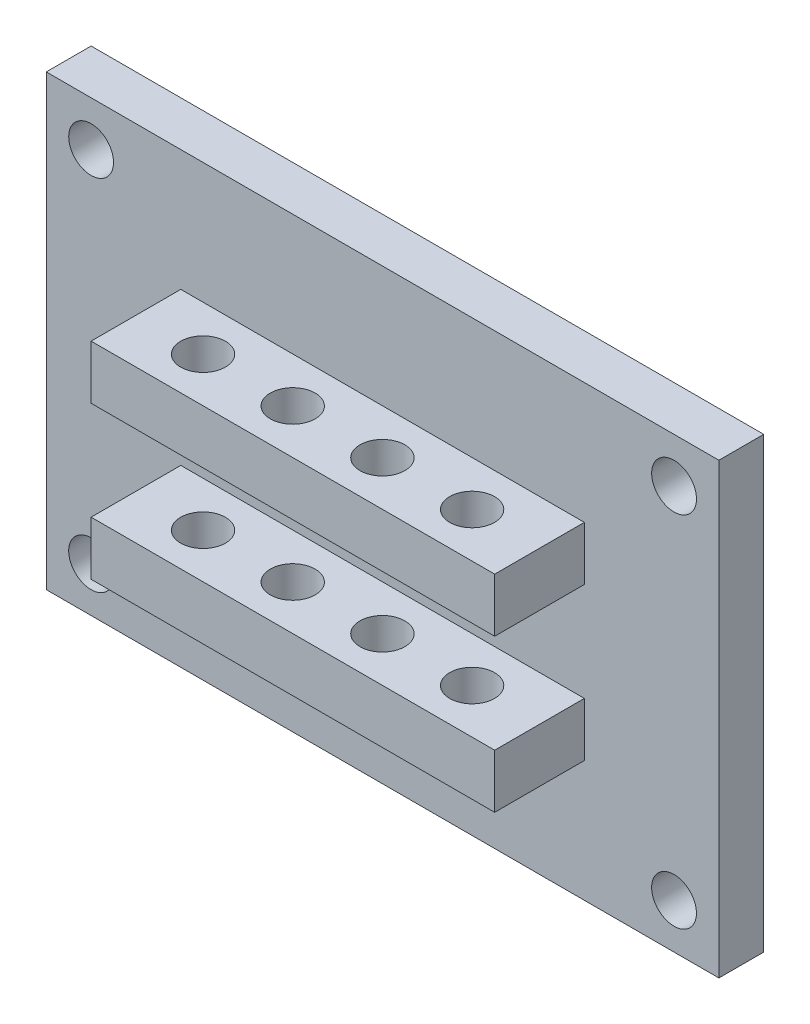
ISO-10303-21;
HEADER;
FILE_DESCRIPTION(('STEP AP214'),'2;1');
FILE_NAME('part.step','',(''),(''),'','','');
FILE_SCHEMA(('AUTOMOTIVE_DESIGN { 1 0 10303 214 1 1 1 1 }'));
ENDSEC;
DATA;
#1=APPLICATION_CONTEXT('core data for automotive mechanical design processes');
#2=APPLICATION_PROTOCOL_DEFINITION('international standard','automotive_design',2000,#1);
#3=PRODUCT_CONTEXT('',#1,'mechanical');
#4=PRODUCT('Part','Part','',(#3));
#5=PRODUCT_RELATED_PRODUCT_CATEGORY('part','',(#4));
#6=PRODUCT_DEFINITION_FORMATION('','',#4);
#7=PRODUCT_DEFINITION_CONTEXT('part definition',#1,'design');
#8=PRODUCT_DEFINITION('design','',#6,#7);
#9=PRODUCT_DEFINITION_SHAPE('','',#8);
#10=(LENGTH_UNIT() NAMED_UNIT(*) SI_UNIT(.MILLI.,.METRE.));
#11=(NAMED_UNIT(*) PLANE_ANGLE_UNIT() SI_UNIT($,.RADIAN.));
#12=(NAMED_UNIT(*) SI_UNIT($,.STERADIAN.) SOLID_ANGLE_UNIT());
#13=UNCERTAINTY_MEASURE_WITH_UNIT(LENGTH_MEASURE(1.E-05),#10,'distance_accuracy_value','');
#14=(GEOMETRIC_REPRESENTATION_CONTEXT(3) GLOBAL_UNCERTAINTY_ASSIGNED_CONTEXT((#13)) GLOBAL_UNIT_ASSIGNED_CONTEXT((#10,
#11,#12)) REPRESENTATION_CONTEXT('',''));
#15=CARTESIAN_POINT('',(0.,0.,0.));
#16=DIRECTION('',(0.,0.,1.));
#17=DIRECTION('',(1.,0.,0.));
#18=AXIS2_PLACEMENT_3D('',#15,#16,#17);
#19=CARTESIAN_POINT('',(0.,0.,0.));
#20=DIRECTION('',(0.,0.,1.));
#21=DIRECTION('',(1.,0.,0.));
#22=AXIS2_PLACEMENT_3D('',#19,#20,#21);
#23=PLANE('',#22);
#24=CARTESIAN_POINT('',(-32.5,-20.,0.));
#25=DIRECTION('',(0.,0.,-1.));
#26=DIRECTION('',(1.,0.,0.));
#27=AXIS2_PLACEMENT_3D('',#24,#25,#26);
#28=CIRCLE('',#27,2.5);
#29=CARTESIAN_POINT('',(-30.,-20.,0.));
#30=VERTEX_POINT('',#29);
#31=EDGE_CURVE('E186',#30,#30,#28,.T.);
#32=ORIENTED_EDGE('',*,*,#31,.T.);
#33=EDGE_LOOP('',(#32));
#34=FACE_BOUND('',#33,.T.);
#35=CARTESIAN_POINT('',(32.5,20.,0.));
#36=DIRECTION('',(0.,0.,-1.));
#37=DIRECTION('',(1.,0.,0.));
#38=AXIS2_PLACEMENT_3D('',#35,#36,#37);
#39=CIRCLE('',#38,2.5);
#40=CARTESIAN_POINT('',(35.,20.,0.));
#41=VERTEX_POINT('',#40);
#42=EDGE_CURVE('E196',#41,#41,#39,.T.);
#43=ORIENTED_EDGE('',*,*,#42,.T.);
#44=EDGE_LOOP('',(#43));
#45=FACE_BOUND('',#44,.T.);
#46=DIRECTION('',(0.,1.,0.));
#47=VECTOR('',#46,1.);
#48=CARTESIAN_POINT('',(-37.5,-25.,0.));
#49=LINE('',#48,#47);
#50=CARTESIAN_POINT('',(-37.5,-25.,0.));
#51=VERTEX_POINT('',#50);
#52=CARTESIAN_POINT('',(-37.5,25.,0.));
#53=VERTEX_POINT('',#52);
#54=EDGE_CURVE('E208',#51,#53,#49,.T.);
#55=ORIENTED_EDGE('',*,*,#54,.F.);
#56=DIRECTION('',(-1.,0.,0.));
#57=VECTOR('',#56,1.);
#58=CARTESIAN_POINT('',(37.5,-25.,0.));
#59=LINE('',#58,#57);
#60=CARTESIAN_POINT('',(37.5,-25.,0.));
#61=VERTEX_POINT('',#60);
#62=EDGE_CURVE('E215',#61,#51,#59,.T.);
#63=ORIENTED_EDGE('',*,*,#62,.F.);
#64=DIRECTION('',(0.,-1.,0.));
#65=VECTOR('',#64,1.);
#66=CARTESIAN_POINT('',(37.5,-25.,0.));
#67=LINE('',#66,#65);
#68=CARTESIAN_POINT('',(37.5,25.,0.));
#69=VERTEX_POINT('',#68);
#70=EDGE_CURVE('E230',#69,#61,#67,.T.);
#71=ORIENTED_EDGE('',*,*,#70,.F.);
#72=DIRECTION('',(1.,0.,0.));
#73=VECTOR('',#72,1.);
#74=CARTESIAN_POINT('',(37.5,25.,0.));
#75=LINE('',#74,#73);
#76=EDGE_CURVE('E227',#53,#69,#75,.T.);
#77=ORIENTED_EDGE('',*,*,#76,.F.);
#78=EDGE_LOOP('',(#55,#63,#71,#77));
#79=FACE_BOUND('',#78,.T.);
#80=CARTESIAN_POINT('',(-32.5,20.,0.));
#81=DIRECTION('',(0.,0.,-1.));
#82=DIRECTION('',(-1.,0.,0.));
#83=AXIS2_PLACEMENT_3D('',#80,#81,#82);
#84=CIRCLE('',#83,2.5);
#85=CARTESIAN_POINT('',(-35.,20.,0.));
#86=VERTEX_POINT('',#85);
#87=EDGE_CURVE('E202',#86,#86,#84,.T.);
#88=ORIENTED_EDGE('',*,*,#87,.T.);
#89=EDGE_LOOP('',(#88));
#90=FACE_BOUND('',#89,.T.);
#91=CARTESIAN_POINT('',(32.5,-20.,0.));
#92=DIRECTION('',(0.,0.,-1.));
#93=DIRECTION('',(-1.,0.,0.));
#94=AXIS2_PLACEMENT_3D('',#91,#92,#93);
#95=CIRCLE('',#94,2.5);
#96=CARTESIAN_POINT('',(30.,-20.,0.));
#97=VERTEX_POINT('',#96);
#98=EDGE_CURVE('E190',#97,#97,#95,.T.);
#99=ORIENTED_EDGE('',*,*,#98,.T.);
#100=EDGE_LOOP('',(#99));
#101=FACE_BOUND('',#100,.T.);
#102=DIRECTION('',(0.,1.,0.));
#103=VECTOR('',#102,1.);
#104=CARTESIAN_POINT('',(22.5,11.5,0.));
#105=LINE('',#104,#103);
#106=CARTESIAN_POINT('',(22.5,5.5,0.));
#107=VERTEX_POINT('',#106);
#108=CARTESIAN_POINT('',(22.5,11.5,0.));
#109=VERTEX_POINT('',#108);
#110=EDGE_CURVE('E74',#107,#109,#105,.T.);
#111=ORIENTED_EDGE('',*,*,#110,.F.);
#112=DIRECTION('',(1.,0.,0.));
#113=VECTOR('',#112,1.);
#114=CARTESIAN_POINT('',(-22.5,5.5,0.));
#115=LINE('',#114,#113);
#116=CARTESIAN_POINT('',(-22.5,5.5,0.));
#117=VERTEX_POINT('',#116);
#118=EDGE_CURVE('E116',#117,#107,#115,.T.);
#119=ORIENTED_EDGE('',*,*,#118,.F.);
#120=DIRECTION('',(0.,-1.,0.));
#121=VECTOR('',#120,1.);
#122=CARTESIAN_POINT('',(-22.5,11.5,0.));
#123=LINE('',#122,#121);
#124=CARTESIAN_POINT('',(-22.5,11.5,0.));
#125=VERTEX_POINT('',#124);
#126=EDGE_CURVE('E114',#125,#117,#123,.T.);
#127=ORIENTED_EDGE('',*,*,#126,.F.);
#128=DIRECTION('',(-1.,0.,0.));
#129=VECTOR('',#128,1.);
#130=CARTESIAN_POINT('',(-22.5,11.5,0.));
#131=LINE('',#130,#129);
#132=EDGE_CURVE('E82',#109,#125,#131,.T.);
#133=ORIENTED_EDGE('',*,*,#132,.F.);
#134=EDGE_LOOP('',(#111,#119,#127,#133));
#135=FACE_BOUND('',#134,.T.);
#136=DIRECTION('',(1.,0.,0.));
#137=VECTOR('',#136,1.);
#138=CARTESIAN_POINT('',(-22.5,-11.5,0.));
#139=LINE('',#138,#137);
#140=CARTESIAN_POINT('',(-22.5,-11.5,0.));
#141=VERTEX_POINT('',#140);
#142=CARTESIAN_POINT('',(22.5,-11.5,0.));
#143=VERTEX_POINT('',#142);
#144=EDGE_CURVE('E171',#141,#143,#139,.T.);
#145=ORIENTED_EDGE('',*,*,#144,.F.);
#146=DIRECTION('',(0.,-1.,0.));
#147=VECTOR('',#146,1.);
#148=CARTESIAN_POINT('',(-22.5,-11.5,0.));
#149=LINE('',#148,#147);
#150=CARTESIAN_POINT('',(-22.5,-5.5,0.));
#151=VERTEX_POINT('',#150);
#152=EDGE_CURVE('E154',#151,#141,#149,.T.);
#153=ORIENTED_EDGE('',*,*,#152,.F.);
#154=DIRECTION('',(-1.,0.,0.));
#155=VECTOR('',#154,1.);
#156=CARTESIAN_POINT('',(-22.5,-5.5,0.));
#157=LINE('',#156,#155);
#158=CARTESIAN_POINT('',(22.5,-5.5,0.));
#159=VERTEX_POINT('',#158);
#160=EDGE_CURVE('E159',#159,#151,#157,.T.);
#161=ORIENTED_EDGE('',*,*,#160,.F.);
#162=DIRECTION('',(0.,1.,0.));
#163=VECTOR('',#162,1.);
#164=CARTESIAN_POINT('',(22.5,-11.5,0.));
#165=LINE('',#164,#163);
#166=EDGE_CURVE('E174',#143,#159,#165,.T.);
#167=ORIENTED_EDGE('',*,*,#166,.F.);
#168=EDGE_LOOP('',(#145,#153,#161,#167));
#169=FACE_BOUND('',#168,.T.);
#170=ADVANCED_FACE('F35',(#34,#45,#79,#90,#101,#135,#169),#23,.T.);
#171=CARTESIAN_POINT('',(22.5,11.5,10.));
#172=DIRECTION('',(-1.,0.,0.));
#173=DIRECTION('',(0.,0.,1.));
#174=AXIS2_PLACEMENT_3D('',#171,#172,#173);
#175=PLANE('',#174);
#176=ORIENTED_EDGE('',*,*,#110,.T.);
#177=DIRECTION('',(0.,0.,-1.));
#178=VECTOR('',#177,1.);
#179=CARTESIAN_POINT('',(22.5,11.5,10.));
#180=LINE('',#179,#178);
#181=CARTESIAN_POINT('',(22.5,11.5,10.));
#182=VERTEX_POINT('',#181);
#183=EDGE_CURVE('E11',#182,#109,#180,.T.);
#184=ORIENTED_EDGE('',*,*,#183,.F.);
#185=DIRECTION('',(0.,1.,0.));
#186=VECTOR('',#185,1.);
#187=CARTESIAN_POINT('',(22.5,11.5,10.));
#188=LINE('',#187,#186);
#189=CARTESIAN_POINT('',(22.5,5.5,10.));
#190=VERTEX_POINT('',#189);
#191=EDGE_CURVE('E94',#190,#182,#188,.T.);
#192=ORIENTED_EDGE('',*,*,#191,.F.);
#193=DIRECTION('',(0.,0.,-1.));
#194=VECTOR('',#193,1.);
#195=CARTESIAN_POINT('',(22.5,5.5,10.));
#196=LINE('',#195,#194);
#197=EDGE_CURVE('E107',#190,#107,#196,.T.);
#198=ORIENTED_EDGE('',*,*,#197,.T.);
#199=EDGE_LOOP('',(#176,#184,#192,#198));
#200=FACE_BOUND('',#199,.T.);
#201=ADVANCED_FACE('F37',(#200),#175,.F.);
#202=CARTESIAN_POINT('',(-22.5,11.5,10.));
#203=DIRECTION('',(0.,-1.,0.));
#204=DIRECTION('',(0.,0.,-1.));
#205=AXIS2_PLACEMENT_3D('',#202,#203,#204);
#206=PLANE('',#205);
#207=CARTESIAN_POINT('',(-15.,11.5,5.01839639959889));
#208=DIRECTION('',(0.,-1.,0.));
#209=DIRECTION('',(0.,0.,-1.));
#210=AXIS2_PLACEMENT_3D('',#207,#208,#209);
#211=CIRCLE('',#210,2.5);
#212=CARTESIAN_POINT('',(-15.,11.5,2.51839639959889));
#213=VERTEX_POINT('',#212);
#214=EDGE_CURVE('E361',#213,#213,#211,.F.);
#215=ORIENTED_EDGE('',*,*,#214,.F.);
#216=EDGE_LOOP('',(#215));
#217=FACE_BOUND('',#216,.T.);
#218=CARTESIAN_POINT('',(15.,11.5,5.01839639959924));
#219=DIRECTION('',(0.,-1.,0.));
#220=DIRECTION('',(0.,0.,-1.));
#221=AXIS2_PLACEMENT_3D('',#218,#219,#220);
#222=CIRCLE('',#221,2.5);
#223=CARTESIAN_POINT('',(15.,11.5,2.51839639959924));
#224=VERTEX_POINT('',#223);
#225=EDGE_CURVE('E365',#224,#224,#222,.F.);
#226=ORIENTED_EDGE('',*,*,#225,.F.);
#227=EDGE_LOOP('',(#226));
#228=FACE_BOUND('',#227,.T.);
#229=CARTESIAN_POINT('',(5.,11.5,5.0183963995991));
#230=DIRECTION('',(0.,-1.,0.));
#231=DIRECTION('',(0.,0.,-1.));
#232=AXIS2_PLACEMENT_3D('',#229,#230,#231);
#233=CIRCLE('',#232,2.5);
#234=CARTESIAN_POINT('',(5.,11.5,2.5183963995991));
#235=VERTEX_POINT('',#234);
#236=EDGE_CURVE('E129',#235,#235,#233,.F.);
#237=ORIENTED_EDGE('',*,*,#236,.F.);
#238=EDGE_LOOP('',(#237));
#239=FACE_BOUND('',#238,.T.);
#240=CARTESIAN_POINT('',(-5.,11.5,5.01839639959896));
#241=DIRECTION('',(0.,-1.,0.));
#242=DIRECTION('',(0.,0.,-1.));
#243=AXIS2_PLACEMENT_3D('',#240,#241,#242);
#244=CIRCLE('',#243,2.5);
#245=CARTESIAN_POINT('',(-5.,11.5,2.51839639959896));
#246=VERTEX_POINT('',#245);
#247=EDGE_CURVE('E125',#246,#246,#244,.F.);
#248=ORIENTED_EDGE('',*,*,#247,.F.);
#249=EDGE_LOOP('',(#248));
#250=FACE_BOUND('',#249,.T.);
#251=ORIENTED_EDGE('',*,*,#132,.T.);
#252=DIRECTION('',(0.,0.,-1.));
#253=VECTOR('',#252,1.);
#254=CARTESIAN_POINT('',(-22.5,11.5,10.));
#255=LINE('',#254,#253);
#256=CARTESIAN_POINT('',(-22.5,11.5,10.));
#257=VERTEX_POINT('',#256);
#258=EDGE_CURVE('E44',#257,#125,#255,.T.);
#259=ORIENTED_EDGE('',*,*,#258,.F.);
#260=DIRECTION('',(-1.,0.,0.));
#261=VECTOR('',#260,1.);
#262=CARTESIAN_POINT('',(-22.5,11.5,10.));
#263=LINE('',#262,#261);
#264=EDGE_CURVE('E87',#182,#257,#263,.T.);
#265=ORIENTED_EDGE('',*,*,#264,.F.);
#266=ORIENTED_EDGE('',*,*,#183,.T.);
#267=EDGE_LOOP('',(#251,#259,#265,#266));
#268=FACE_BOUND('',#267,.T.);
#269=ADVANCED_FACE('F99',(#217,#228,#239,#250,#268),#206,.F.);
#270=CARTESIAN_POINT('',(-22.5,11.5,10.));
#271=DIRECTION('',(1.,0.,0.));
#272=DIRECTION('',(0.,0.,-1.));
#273=AXIS2_PLACEMENT_3D('',#270,#271,#272);
#274=PLANE('',#273);
#275=ORIENTED_EDGE('',*,*,#126,.T.);
#276=DIRECTION('',(0.,0.,-1.));
#277=VECTOR('',#276,1.);
#278=CARTESIAN_POINT('',(-22.5,5.5,10.));
#279=LINE('',#278,#277);
#280=CARTESIAN_POINT('',(-22.5,5.5,10.));
#281=VERTEX_POINT('',#280);
#282=EDGE_CURVE('E102',#281,#117,#279,.T.);
#283=ORIENTED_EDGE('',*,*,#282,.F.);
#284=DIRECTION('',(0.,-1.,0.));
#285=VECTOR('',#284,1.);
#286=CARTESIAN_POINT('',(-22.5,11.5,10.));
#287=LINE('',#286,#285);
#288=EDGE_CURVE('E91',#257,#281,#287,.T.);
#289=ORIENTED_EDGE('',*,*,#288,.F.);
#290=ORIENTED_EDGE('',*,*,#258,.T.);
#291=EDGE_LOOP('',(#275,#283,#289,#290));
#292=FACE_BOUND('',#291,.T.);
#293=ADVANCED_FACE('F104',(#292),#274,.F.);
#294=CARTESIAN_POINT('',(-22.5,5.5,10.));
#295=DIRECTION('',(0.,1.,0.));
#296=DIRECTION('',(0.,0.,1.));
#297=AXIS2_PLACEMENT_3D('',#294,#295,#296);
#298=PLANE('',#297);
#299=CARTESIAN_POINT('',(-15.,5.5,5.01839639959889));
#300=DIRECTION('',(0.,1.,0.));
#301=DIRECTION('',(0.,0.,1.));
#302=AXIS2_PLACEMENT_3D('',#299,#300,#301);
#303=CIRCLE('',#302,2.5);
#304=CARTESIAN_POINT('',(-15.,5.5,7.51839639959889));
#305=VERTEX_POINT('',#304);
#306=EDGE_CURVE('E144',#305,#305,#303,.T.);
#307=ORIENTED_EDGE('',*,*,#306,.T.);
#308=EDGE_LOOP('',(#307));
#309=FACE_BOUND('',#308,.T.);
#310=CARTESIAN_POINT('',(15.,5.5,5.01839639959924));
#311=DIRECTION('',(0.,1.,0.));
#312=DIRECTION('',(0.,0.,1.));
#313=AXIS2_PLACEMENT_3D('',#310,#311,#312);
#314=CIRCLE('',#313,2.5);
#315=CARTESIAN_POINT('',(15.,5.5,7.51839639959924));
#316=VERTEX_POINT('',#315);
#317=EDGE_CURVE('E132',#316,#316,#314,.T.);
#318=ORIENTED_EDGE('',*,*,#317,.T.);
#319=EDGE_LOOP('',(#318));
#320=FACE_BOUND('',#319,.T.);
#321=CARTESIAN_POINT('',(5.,5.5,5.0183963995991));
#322=DIRECTION('',(0.,1.,0.));
#323=DIRECTION('',(0.,0.,1.));
#324=AXIS2_PLACEMENT_3D('',#321,#322,#323);
#325=CIRCLE('',#324,2.5);
#326=CARTESIAN_POINT('',(5.,5.5,7.5183963995991));
#327=VERTEX_POINT('',#326);
#328=EDGE_CURVE('E128',#327,#327,#325,.T.);
#329=ORIENTED_EDGE('',*,*,#328,.T.);
#330=EDGE_LOOP('',(#329));
#331=FACE_BOUND('',#330,.T.);
#332=CARTESIAN_POINT('',(-5.,5.5,5.01839639959896));
#333=DIRECTION('',(0.,1.,0.));
#334=DIRECTION('',(0.,0.,1.));
#335=AXIS2_PLACEMENT_3D('',#332,#333,#334);
#336=CIRCLE('',#335,2.5);
#337=CARTESIAN_POINT('',(-5.,5.5,7.51839639959896));
#338=VERTEX_POINT('',#337);
#339=EDGE_CURVE('E124',#338,#338,#336,.T.);
#340=ORIENTED_EDGE('',*,*,#339,.T.);
#341=EDGE_LOOP('',(#340));
#342=FACE_BOUND('',#341,.T.);
#343=ORIENTED_EDGE('',*,*,#118,.T.);
#344=ORIENTED_EDGE('',*,*,#197,.F.);
#345=DIRECTION('',(1.,0.,0.));
#346=VECTOR('',#345,1.);
#347=CARTESIAN_POINT('',(-22.5,5.5,10.));
#348=LINE('',#347,#346);
#349=EDGE_CURVE('E61',#281,#190,#348,.T.);
#350=ORIENTED_EDGE('',*,*,#349,.F.);
#351=ORIENTED_EDGE('',*,*,#282,.T.);
#352=EDGE_LOOP('',(#343,#344,#350,#351));
#353=FACE_BOUND('',#352,.T.);
#354=ADVANCED_FACE('F349',(#309,#320,#331,#342,#353),#298,.F.);
#355=CARTESIAN_POINT('',(0.,0.,10.));
#356=DIRECTION('',(0.,0.,1.));
#357=DIRECTION('',(1.,0.,0.));
#358=AXIS2_PLACEMENT_3D('',#355,#356,#357);
#359=PLANE('',#358);
#360=ORIENTED_EDGE('',*,*,#191,.T.);
#361=ORIENTED_EDGE('',*,*,#264,.T.);
#362=ORIENTED_EDGE('',*,*,#288,.T.);
#363=ORIENTED_EDGE('',*,*,#349,.T.);
#364=EDGE_LOOP('',(#360,#361,#362,#363));
#365=FACE_BOUND('',#364,.T.);
#366=ADVANCED_FACE('F89',(#365),#359,.T.);
#367=CARTESIAN_POINT('',(0.,0.,-5.));
#368=DIRECTION('',(0.,0.,1.));
#369=DIRECTION('',(1.,0.,0.));
#370=AXIS2_PLACEMENT_3D('',#367,#368,#369);
#371=PLANE('',#370);
#372=DIRECTION('',(0.,1.,0.));
#373=VECTOR('',#372,1.);
#374=CARTESIAN_POINT('',(-37.5,-25.,-5.));
#375=LINE('',#374,#373);
#376=CARTESIAN_POINT('',(-37.5,-25.,-5.));
#377=VERTEX_POINT('',#376);
#378=CARTESIAN_POINT('',(-37.5,25.,-5.));
#379=VERTEX_POINT('',#378);
#380=EDGE_CURVE('E211',#377,#379,#375,.T.);
#381=ORIENTED_EDGE('',*,*,#380,.T.);
#382=DIRECTION('',(1.,0.,0.));
#383=VECTOR('',#382,1.);
#384=CARTESIAN_POINT('',(37.5,25.,-5.));
#385=LINE('',#384,#383);
#386=CARTESIAN_POINT('',(37.5,25.,-5.));
#387=VERTEX_POINT('',#386);
#388=EDGE_CURVE('E214',#379,#387,#385,.T.);
#389=ORIENTED_EDGE('',*,*,#388,.T.);
#390=DIRECTION('',(0.,-1.,0.));
#391=VECTOR('',#390,1.);
#392=CARTESIAN_POINT('',(37.5,-25.,-5.));
#393=LINE('',#392,#391);
#394=CARTESIAN_POINT('',(37.5,-25.,-5.));
#395=VERTEX_POINT('',#394);
#396=EDGE_CURVE('E218',#387,#395,#393,.T.);
#397=ORIENTED_EDGE('',*,*,#396,.T.);
#398=DIRECTION('',(-1.,0.,0.));
#399=VECTOR('',#398,1.);
#400=CARTESIAN_POINT('',(37.5,-25.,-5.));
#401=LINE('',#400,#399);
#402=EDGE_CURVE('E221',#395,#377,#401,.T.);
#403=ORIENTED_EDGE('',*,*,#402,.T.);
#404=EDGE_LOOP('',(#381,#389,#397,#403));
#405=FACE_BOUND('',#404,.T.);
#406=CARTESIAN_POINT('',(-32.5,20.,-5.));
#407=DIRECTION('',(0.,0.,-1.));
#408=DIRECTION('',(-1.,0.,0.));
#409=AXIS2_PLACEMENT_3D('',#406,#407,#408);
#410=CIRCLE('',#409,2.5);
#411=CARTESIAN_POINT('',(-35.,20.,-5.));
#412=VERTEX_POINT('',#411);
#413=EDGE_CURVE('E205',#412,#412,#410,.T.);
#414=ORIENTED_EDGE('',*,*,#413,.F.);
#415=EDGE_LOOP('',(#414));
#416=FACE_BOUND('',#415,.T.);
#417=CARTESIAN_POINT('',(32.5,20.,-5.));
#418=DIRECTION('',(0.,0.,-1.));
#419=DIRECTION('',(1.,0.,0.));
#420=AXIS2_PLACEMENT_3D('',#417,#418,#419);
#421=CIRCLE('',#420,2.5);
#422=CARTESIAN_POINT('',(35.,20.,-5.));
#423=VERTEX_POINT('',#422);
#424=EDGE_CURVE('E199',#423,#423,#421,.T.);
#425=ORIENTED_EDGE('',*,*,#424,.F.);
#426=EDGE_LOOP('',(#425));
#427=FACE_BOUND('',#426,.T.);
#428=CARTESIAN_POINT('',(32.5,-20.,-5.));
#429=DIRECTION('',(0.,0.,-1.));
#430=DIRECTION('',(-1.,0.,0.));
#431=AXIS2_PLACEMENT_3D('',#428,#429,#430);
#432=CIRCLE('',#431,2.5);
#433=CARTESIAN_POINT('',(30.,-20.,-5.));
#434=VERTEX_POINT('',#433);
#435=EDGE_CURVE('E193',#434,#434,#432,.T.);
#436=ORIENTED_EDGE('',*,*,#435,.F.);
#437=EDGE_LOOP('',(#436));
#438=FACE_BOUND('',#437,.T.);
#439=CARTESIAN_POINT('',(-32.5,-20.,-5.));
#440=DIRECTION('',(0.,0.,-1.));
#441=DIRECTION('',(1.,0.,0.));
#442=AXIS2_PLACEMENT_3D('',#439,#440,#441);
#443=CIRCLE('',#442,2.5);
#444=CARTESIAN_POINT('',(-30.,-20.,-5.));
#445=VERTEX_POINT('',#444);
#446=EDGE_CURVE('E187',#445,#445,#443,.T.);
#447=ORIENTED_EDGE('',*,*,#446,.F.);
#448=EDGE_LOOP('',(#447));
#449=FACE_BOUND('',#448,.T.);
#450=ADVANCED_FACE('F333',(#405,#416,#427,#438,#449),#371,.F.);
#451=CARTESIAN_POINT('',(-37.5,-25.,-5.));
#452=DIRECTION('',(1.,0.,0.));
#453=DIRECTION('',(0.,0.,-1.));
#454=AXIS2_PLACEMENT_3D('',#451,#452,#453);
#455=PLANE('',#454);
#456=ORIENTED_EDGE('',*,*,#54,.T.);
#457=DIRECTION('',(0.,0.,1.));
#458=VECTOR('',#457,1.);
#459=CARTESIAN_POINT('',(-37.5,25.,-5.));
#460=LINE('',#459,#458);
#461=EDGE_CURVE('E112',#379,#53,#460,.T.);
#462=ORIENTED_EDGE('',*,*,#461,.F.);
#463=ORIENTED_EDGE('',*,*,#380,.F.);
#464=DIRECTION('',(0.,0.,1.));
#465=VECTOR('',#464,1.);
#466=CARTESIAN_POINT('',(-37.5,-25.,-5.));
#467=LINE('',#466,#465);
#468=EDGE_CURVE('E224',#377,#51,#467,.T.);
#469=ORIENTED_EDGE('',*,*,#468,.T.);
#470=EDGE_LOOP('',(#456,#462,#463,#469));
#471=FACE_BOUND('',#470,.T.);
#472=ADVANCED_FACE('F258',(#471),#455,.F.);
#473=CARTESIAN_POINT('',(37.5,25.,-5.));
#474=DIRECTION('',(0.,-1.,0.));
#475=DIRECTION('',(0.,0.,-1.));
#476=AXIS2_PLACEMENT_3D('',#473,#474,#475);
#477=PLANE('',#476);
#478=ORIENTED_EDGE('',*,*,#76,.T.);
#479=DIRECTION('',(0.,0.,1.));
#480=VECTOR('',#479,1.);
#481=CARTESIAN_POINT('',(37.5,25.,-5.));
#482=LINE('',#481,#480);
#483=EDGE_CURVE('E240',#387,#69,#482,.T.);
#484=ORIENTED_EDGE('',*,*,#483,.F.);
#485=ORIENTED_EDGE('',*,*,#388,.F.);
#486=ORIENTED_EDGE('',*,*,#461,.T.);
#487=EDGE_LOOP('',(#478,#484,#485,#486));
#488=FACE_BOUND('',#487,.T.);
#489=ADVANCED_FACE('F248',(#488),#477,.F.);
#490=CARTESIAN_POINT('',(37.5,-25.,-5.));
#491=DIRECTION('',(-1.,0.,0.));
#492=DIRECTION('',(0.,0.,1.));
#493=AXIS2_PLACEMENT_3D('',#490,#491,#492);
#494=PLANE('',#493);
#495=ORIENTED_EDGE('',*,*,#70,.T.);
#496=DIRECTION('',(0.,0.,1.));
#497=VECTOR('',#496,1.);
#498=CARTESIAN_POINT('',(37.5,-25.,-5.));
#499=LINE('',#498,#497);
#500=EDGE_CURVE('E237',#395,#61,#499,.T.);
#501=ORIENTED_EDGE('',*,*,#500,.F.);
#502=ORIENTED_EDGE('',*,*,#396,.F.);
#503=ORIENTED_EDGE('',*,*,#483,.T.);
#504=EDGE_LOOP('',(#495,#501,#502,#503));
#505=FACE_BOUND('',#504,.T.);
#506=ADVANCED_FACE('F339',(#505),#494,.F.);
#507=CARTESIAN_POINT('',(37.5,-25.,-5.));
#508=DIRECTION('',(0.,1.,0.));
#509=DIRECTION('',(0.,0.,1.));
#510=AXIS2_PLACEMENT_3D('',#507,#508,#509);
#511=PLANE('',#510);
#512=ORIENTED_EDGE('',*,*,#62,.T.);
#513=ORIENTED_EDGE('',*,*,#468,.F.);
#514=ORIENTED_EDGE('',*,*,#402,.F.);
#515=ORIENTED_EDGE('',*,*,#500,.T.);
#516=EDGE_LOOP('',(#512,#513,#514,#515));
#517=FACE_BOUND('',#516,.T.);
#518=ADVANCED_FACE('F335',(#517),#511,.F.);
#519=CARTESIAN_POINT('',(-32.5,20.,-5.));
#520=DIRECTION('',(0.,0.,1.));
#521=DIRECTION('',(1.,0.,0.));
#522=AXIS2_PLACEMENT_3D('',#519,#520,#521);
#523=CYLINDRICAL_SURFACE('',#522,2.5);
#524=ORIENTED_EDGE('',*,*,#413,.T.);
#525=EDGE_LOOP('',(#524));
#526=FACE_BOUND('',#525,.T.);
#527=ORIENTED_EDGE('',*,*,#87,.F.);
#528=EDGE_LOOP('',(#527));
#529=FACE_BOUND('',#528,.T.);
#530=ADVANCED_FACE('F338',(#526,#529),#523,.F.);
#531=CARTESIAN_POINT('',(32.5,20.,-5.));
#532=DIRECTION('',(0.,0.,1.));
#533=DIRECTION('',(1.,0.,0.));
#534=AXIS2_PLACEMENT_3D('',#531,#532,#533);
#535=CYLINDRICAL_SURFACE('',#534,2.5);
#536=ORIENTED_EDGE('',*,*,#424,.T.);
#537=EDGE_LOOP('',(#536));
#538=FACE_BOUND('',#537,.T.);
#539=ORIENTED_EDGE('',*,*,#42,.F.);
#540=EDGE_LOOP('',(#539));
#541=FACE_BOUND('',#540,.T.);
#542=ADVANCED_FACE('F446',(#538,#541),#535,.F.);
#543=CARTESIAN_POINT('',(32.5,-20.,-5.));
#544=DIRECTION('',(0.,0.,1.));
#545=DIRECTION('',(1.,0.,0.));
#546=AXIS2_PLACEMENT_3D('',#543,#544,#545);
#547=CYLINDRICAL_SURFACE('',#546,2.5);
#548=ORIENTED_EDGE('',*,*,#435,.T.);
#549=EDGE_LOOP('',(#548));
#550=FACE_BOUND('',#549,.T.);
#551=ORIENTED_EDGE('',*,*,#98,.F.);
#552=EDGE_LOOP('',(#551));
#553=FACE_BOUND('',#552,.T.);
#554=ADVANCED_FACE('F442',(#550,#553),#547,.F.);
#555=CARTESIAN_POINT('',(-32.5,-20.,-5.));
#556=DIRECTION('',(0.,0.,1.));
#557=DIRECTION('',(1.,0.,0.));
#558=AXIS2_PLACEMENT_3D('',#555,#556,#557);
#559=CYLINDRICAL_SURFACE('',#558,2.5);
#560=ORIENTED_EDGE('',*,*,#446,.T.);
#561=EDGE_LOOP('',(#560));
#562=FACE_BOUND('',#561,.T.);
#563=ORIENTED_EDGE('',*,*,#31,.F.);
#564=EDGE_LOOP('',(#563));
#565=FACE_BOUND('',#564,.T.);
#566=ADVANCED_FACE('F436',(#562,#565),#559,.F.);
#567=CARTESIAN_POINT('',(-22.5,-11.5,10.));
#568=DIRECTION('',(1.,0.,0.));
#569=DIRECTION('',(0.,0.,-1.));
#570=AXIS2_PLACEMENT_3D('',#567,#568,#569);
#571=PLANE('',#570);
#572=ORIENTED_EDGE('',*,*,#152,.T.);
#573=DIRECTION('',(0.,0.,-1.));
#574=VECTOR('',#573,1.);
#575=CARTESIAN_POINT('',(-22.5,-11.5,10.));
#576=LINE('',#575,#574);
#577=CARTESIAN_POINT('',(-22.5,-11.5,10.));
#578=VERTEX_POINT('',#577);
#579=EDGE_CURVE('E183',#578,#141,#576,.T.);
#580=ORIENTED_EDGE('',*,*,#579,.F.);
#581=DIRECTION('',(0.,-1.,0.));
#582=VECTOR('',#581,1.);
#583=CARTESIAN_POINT('',(-22.5,-11.5,10.));
#584=LINE('',#583,#582);
#585=CARTESIAN_POINT('',(-22.5,-5.5,10.));
#586=VERTEX_POINT('',#585);
#587=EDGE_CURVE('E155',#586,#578,#584,.T.);
#588=ORIENTED_EDGE('',*,*,#587,.F.);
#589=DIRECTION('',(0.,0.,-1.));
#590=VECTOR('',#589,1.);
#591=CARTESIAN_POINT('',(-22.5,-5.5,10.));
#592=LINE('',#591,#590);
#593=EDGE_CURVE('E168',#586,#151,#592,.T.);
#594=ORIENTED_EDGE('',*,*,#593,.T.);
#595=EDGE_LOOP('',(#572,#580,#588,#594));
#596=FACE_BOUND('',#595,.T.);
#597=ADVANCED_FACE('F303',(#596),#571,.F.);
#598=CARTESIAN_POINT('',(-22.5,-11.5,10.));
#599=DIRECTION('',(0.,1.,0.));
#600=DIRECTION('',(0.,0.,1.));
#601=AXIS2_PLACEMENT_3D('',#598,#599,#600);
#602=PLANE('',#601);
#603=CARTESIAN_POINT('',(-15.,-11.5,5.01839639959889));
#604=DIRECTION('',(0.,-1.,0.));
#605=DIRECTION('',(0.,0.,-1.));
#606=AXIS2_PLACEMENT_3D('',#603,#604,#605);
#607=CIRCLE('',#606,2.5);
#608=CARTESIAN_POINT('',(-15.,-11.5,2.51839639959889));
#609=VERTEX_POINT('',#608);
#610=EDGE_CURVE('E416',#609,#609,#607,.T.);
#611=ORIENTED_EDGE('',*,*,#610,.F.);
#612=EDGE_LOOP('',(#611));
#613=FACE_BOUND('',#612,.T.);
#614=CARTESIAN_POINT('',(15.,-11.5,5.01839639959924));
#615=DIRECTION('',(0.,-1.,0.));
#616=DIRECTION('',(0.,0.,-1.));
#617=AXIS2_PLACEMENT_3D('',#614,#615,#616);
#618=CIRCLE('',#617,2.5);
#619=CARTESIAN_POINT('',(15.,-11.5,2.51839639959924));
#620=VERTEX_POINT('',#619);
#621=EDGE_CURVE('E411',#620,#620,#618,.T.);
#622=ORIENTED_EDGE('',*,*,#621,.F.);
#623=EDGE_LOOP('',(#622));
#624=FACE_BOUND('',#623,.T.);
#625=CARTESIAN_POINT('',(5.,-11.5,5.0183963995991));
#626=DIRECTION('',(0.,-1.,0.));
#627=DIRECTION('',(0.,0.,-1.));
#628=AXIS2_PLACEMENT_3D('',#625,#626,#627);
#629=CIRCLE('',#628,2.5);
#630=CARTESIAN_POINT('',(5.,-11.5,2.5183963995991));
#631=VERTEX_POINT('',#630);
#632=EDGE_CURVE('E414',#631,#631,#629,.T.);
#633=ORIENTED_EDGE('',*,*,#632,.F.);
#634=EDGE_LOOP('',(#633));
#635=FACE_BOUND('',#634,.T.);
#636=CARTESIAN_POINT('',(-5.,-11.5,5.01839639959896));
#637=DIRECTION('',(0.,-1.,0.));
#638=DIRECTION('',(0.,0.,-1.));
#639=AXIS2_PLACEMENT_3D('',#636,#637,#638);
#640=CIRCLE('',#639,2.5);
#641=CARTESIAN_POINT('',(-5.,-11.5,2.51839639959896));
#642=VERTEX_POINT('',#641);
#643=EDGE_CURVE('E147',#642,#642,#640,.T.);
#644=ORIENTED_EDGE('',*,*,#643,.F.);
#645=EDGE_LOOP('',(#644));
#646=FACE_BOUND('',#645,.T.);
#647=ORIENTED_EDGE('',*,*,#144,.T.);
#648=DIRECTION('',(0.,0.,-1.));
#649=VECTOR('',#648,1.);
#650=CARTESIAN_POINT('',(22.5,-11.5,10.));
#651=LINE('',#650,#649);
#652=CARTESIAN_POINT('',(22.5,-11.5,10.));
#653=VERTEX_POINT('',#652);
#654=EDGE_CURVE('E180',#653,#143,#651,.T.);
#655=ORIENTED_EDGE('',*,*,#654,.F.);
#656=DIRECTION('',(1.,0.,0.));
#657=VECTOR('',#656,1.);
#658=CARTESIAN_POINT('',(-22.5,-11.5,10.));
#659=LINE('',#658,#657);
#660=EDGE_CURVE('E158',#578,#653,#659,.T.);
#661=ORIENTED_EDGE('',*,*,#660,.F.);
#662=ORIENTED_EDGE('',*,*,#579,.T.);
#663=EDGE_LOOP('',(#647,#655,#661,#662));
#664=FACE_BOUND('',#663,.T.);
#665=ADVANCED_FACE('F295',(#613,#624,#635,#646,#664),#602,.F.);
#666=CARTESIAN_POINT('',(22.5,-11.5,10.));
#667=DIRECTION('',(-1.,0.,0.));
#668=DIRECTION('',(0.,0.,1.));
#669=AXIS2_PLACEMENT_3D('',#666,#667,#668);
#670=PLANE('',#669);
#671=ORIENTED_EDGE('',*,*,#166,.T.);
#672=DIRECTION('',(0.,0.,-1.));
#673=VECTOR('',#672,1.);
#674=CARTESIAN_POINT('',(22.5,-5.5,10.));
#675=LINE('',#674,#673);
#676=CARTESIAN_POINT('',(22.5,-5.5,10.));
#677=VERTEX_POINT('',#676);
#678=EDGE_CURVE('E52',#677,#159,#675,.T.);
#679=ORIENTED_EDGE('',*,*,#678,.F.);
#680=DIRECTION('',(0.,1.,0.));
#681=VECTOR('',#680,1.);
#682=CARTESIAN_POINT('',(22.5,-11.5,10.));
#683=LINE('',#682,#681);
#684=EDGE_CURVE('E162',#653,#677,#683,.T.);
#685=ORIENTED_EDGE('',*,*,#684,.F.);
#686=ORIENTED_EDGE('',*,*,#654,.T.);
#687=EDGE_LOOP('',(#671,#679,#685,#686));
#688=FACE_BOUND('',#687,.T.);
#689=ADVANCED_FACE('F310',(#688),#670,.F.);
#690=CARTESIAN_POINT('',(-22.5,-5.5,10.));
#691=DIRECTION('',(0.,-1.,0.));
#692=DIRECTION('',(0.,0.,-1.));
#693=AXIS2_PLACEMENT_3D('',#690,#691,#692);
#694=PLANE('',#693);
#695=CARTESIAN_POINT('',(-15.,-5.5,5.01839639959889));
#696=DIRECTION('',(0.,-1.,0.));
#697=DIRECTION('',(0.,0.,-1.));
#698=AXIS2_PLACEMENT_3D('',#695,#696,#697);
#699=CIRCLE('',#698,2.5);
#700=CARTESIAN_POINT('',(-15.,-5.5,2.51839639959889));
#701=VERTEX_POINT('',#700);
#702=EDGE_CURVE('E39',#701,#701,#699,.T.);
#703=ORIENTED_EDGE('',*,*,#702,.T.);
#704=EDGE_LOOP('',(#703));
#705=FACE_BOUND('',#704,.T.);
#706=CARTESIAN_POINT('',(15.,-5.5,5.01839639959924));
#707=DIRECTION('',(0.,-1.,0.));
#708=DIRECTION('',(0.,0.,-1.));
#709=AXIS2_PLACEMENT_3D('',#706,#707,#708);
#710=CIRCLE('',#709,2.5);
#711=CARTESIAN_POINT('',(15.,-5.5,2.51839639959924));
#712=VERTEX_POINT('',#711);
#713=EDGE_CURVE('E130',#712,#712,#710,.T.);
#714=ORIENTED_EDGE('',*,*,#713,.T.);
#715=EDGE_LOOP('',(#714));
#716=FACE_BOUND('',#715,.T.);
#717=CARTESIAN_POINT('',(5.,-5.5,5.0183963995991));
#718=DIRECTION('',(0.,-1.,0.));
#719=DIRECTION('',(0.,0.,-1.));
#720=AXIS2_PLACEMENT_3D('',#717,#718,#719);
#721=CIRCLE('',#720,2.5);
#722=CARTESIAN_POINT('',(5.,-5.5,2.5183963995991));
#723=VERTEX_POINT('',#722);
#724=EDGE_CURVE('E126',#723,#723,#721,.T.);
#725=ORIENTED_EDGE('',*,*,#724,.T.);
#726=EDGE_LOOP('',(#725));
#727=FACE_BOUND('',#726,.T.);
#728=CARTESIAN_POINT('',(-5.,-5.5,5.01839639959896));
#729=DIRECTION('',(0.,-1.,0.));
#730=DIRECTION('',(0.,0.,-1.));
#731=AXIS2_PLACEMENT_3D('',#728,#729,#730);
#732=CIRCLE('',#731,2.5);
#733=CARTESIAN_POINT('',(-5.,-5.5,2.51839639959896));
#734=VERTEX_POINT('',#733);
#735=EDGE_CURVE('E121',#734,#734,#732,.T.);
#736=ORIENTED_EDGE('',*,*,#735,.T.);
#737=EDGE_LOOP('',(#736));
#738=FACE_BOUND('',#737,.T.);
#739=ORIENTED_EDGE('',*,*,#160,.T.);
#740=ORIENTED_EDGE('',*,*,#593,.F.);
#741=DIRECTION('',(-1.,0.,0.));
#742=VECTOR('',#741,1.);
#743=CARTESIAN_POINT('',(-22.5,-5.5,10.));
#744=LINE('',#743,#742);
#745=EDGE_CURVE('E165',#677,#586,#744,.T.);
#746=ORIENTED_EDGE('',*,*,#745,.F.);
#747=ORIENTED_EDGE('',*,*,#678,.T.);
#748=EDGE_LOOP('',(#739,#740,#746,#747));
#749=FACE_BOUND('',#748,.T.);
#750=ADVANCED_FACE('F311',(#705,#716,#727,#738,#749),#694,.F.);
#751=CARTESIAN_POINT('',(0.,0.,10.));
#752=DIRECTION('',(0.,0.,-1.));
#753=DIRECTION('',(-1.,0.,0.));
#754=AXIS2_PLACEMENT_3D('',#751,#752,#753);
#755=PLANE('',#754);
#756=ORIENTED_EDGE('',*,*,#587,.T.);
#757=ORIENTED_EDGE('',*,*,#660,.T.);
#758=ORIENTED_EDGE('',*,*,#684,.T.);
#759=ORIENTED_EDGE('',*,*,#745,.T.);
#760=EDGE_LOOP('',(#756,#757,#758,#759));
#761=FACE_BOUND('',#760,.T.);
#762=ADVANCED_FACE('F300',(#761),#755,.F.);
#763=CARTESIAN_POINT('',(-5.,18.5710678118655,5.01839639959896));
#764=DIRECTION('',(0.,-1.,0.));
#765=DIRECTION('',(0.,0.,-1.));
#766=AXIS2_PLACEMENT_3D('',#763,#764,#765);
#767=CYLINDRICAL_SURFACE('',#766,2.5);
#768=ORIENTED_EDGE('',*,*,#643,.T.);
#769=EDGE_LOOP('',(#768));
#770=FACE_BOUND('',#769,.T.);
#771=ORIENTED_EDGE('',*,*,#735,.F.);
#772=EDGE_LOOP('',(#771));
#773=FACE_BOUND('',#772,.T.);
#774=ADVANCED_FACE('F319',(#770,#773),#767,.F.);
#775=ORIENTED_EDGE('',*,*,#247,.T.);
#776=EDGE_LOOP('',(#775));
#777=FACE_BOUND('',#776,.T.);
#778=ORIENTED_EDGE('',*,*,#339,.F.);
#779=EDGE_LOOP('',(#778));
#780=FACE_BOUND('',#779,.T.);
#781=ADVANCED_FACE('F371',(#777,#780),#767,.F.);
#782=CARTESIAN_POINT('',(5.,18.5710678118655,5.0183963995991));
#783=DIRECTION('',(0.,-1.,0.));
#784=DIRECTION('',(0.,0.,-1.));
#785=AXIS2_PLACEMENT_3D('',#782,#783,#784);
#786=CYLINDRICAL_SURFACE('',#785,2.5);
#787=ORIENTED_EDGE('',*,*,#632,.T.);
#788=EDGE_LOOP('',(#787));
#789=FACE_BOUND('',#788,.T.);
#790=ORIENTED_EDGE('',*,*,#724,.F.);
#791=EDGE_LOOP('',(#790));
#792=FACE_BOUND('',#791,.T.);
#793=ADVANCED_FACE('F374',(#789,#792),#786,.F.);
#794=CARTESIAN_POINT('',(15.,18.5710678118655,5.01839639959924));
#795=DIRECTION('',(0.,-1.,0.));
#796=DIRECTION('',(0.,0.,-1.));
#797=AXIS2_PLACEMENT_3D('',#794,#795,#796);
#798=CYLINDRICAL_SURFACE('',#797,2.5);
#799=ORIENTED_EDGE('',*,*,#621,.T.);
#800=EDGE_LOOP('',(#799));
#801=FACE_BOUND('',#800,.T.);
#802=ORIENTED_EDGE('',*,*,#713,.F.);
#803=EDGE_LOOP('',(#802));
#804=FACE_BOUND('',#803,.T.);
#805=ADVANCED_FACE('F383',(#801,#804),#798,.F.);
#806=CARTESIAN_POINT('',(-15.,18.5710678118655,5.01839639959889));
#807=DIRECTION('',(0.,-1.,0.));
#808=DIRECTION('',(0.,0.,-1.));
#809=AXIS2_PLACEMENT_3D('',#806,#807,#808);
#810=CYLINDRICAL_SURFACE('',#809,2.5);
#811=ORIENTED_EDGE('',*,*,#610,.T.);
#812=EDGE_LOOP('',(#811));
#813=FACE_BOUND('',#812,.T.);
#814=ORIENTED_EDGE('',*,*,#702,.F.);
#815=EDGE_LOOP('',(#814));
#816=FACE_BOUND('',#815,.T.);
#817=ADVANCED_FACE('F391',(#813,#816),#810,.F.);
#818=ORIENTED_EDGE('',*,*,#236,.T.);
#819=EDGE_LOOP('',(#818));
#820=FACE_BOUND('',#819,.T.);
#821=ORIENTED_EDGE('',*,*,#328,.F.);
#822=EDGE_LOOP('',(#821));
#823=FACE_BOUND('',#822,.T.);
#824=ADVANCED_FACE('F386',(#820,#823),#786,.F.);
#825=ORIENTED_EDGE('',*,*,#225,.T.);
#826=EDGE_LOOP('',(#825));
#827=FACE_BOUND('',#826,.T.);
#828=ORIENTED_EDGE('',*,*,#317,.F.);
#829=EDGE_LOOP('',(#828));
#830=FACE_BOUND('',#829,.T.);
#831=ADVANCED_FACE('F390',(#827,#830),#798,.F.);
#832=ORIENTED_EDGE('',*,*,#214,.T.);
#833=EDGE_LOOP('',(#832));
#834=FACE_BOUND('',#833,.T.);
#835=ORIENTED_EDGE('',*,*,#306,.F.);
#836=EDGE_LOOP('',(#835));
#837=FACE_BOUND('',#836,.T.);
#838=ADVANCED_FACE('F393',(#834,#837),#810,.F.);
#839=CLOSED_SHELL('',(#170,#201,#269,#293,#354,#366,#450,#472,#489,#506,#518,#530,#542,#554,
#566,#597,#665,#689,#750,#762,#774,#781,#793,#805,#817,#824,#831,#838));
#840=MANIFOLD_SOLID_BREP('B2',#839);
#841=ADVANCED_BREP_SHAPE_REPRESENTATION('',(#18,#840),#14);
#842=SHAPE_DEFINITION_REPRESENTATION(#9,#841);
ENDSEC;
END-ISO-10303-21;
